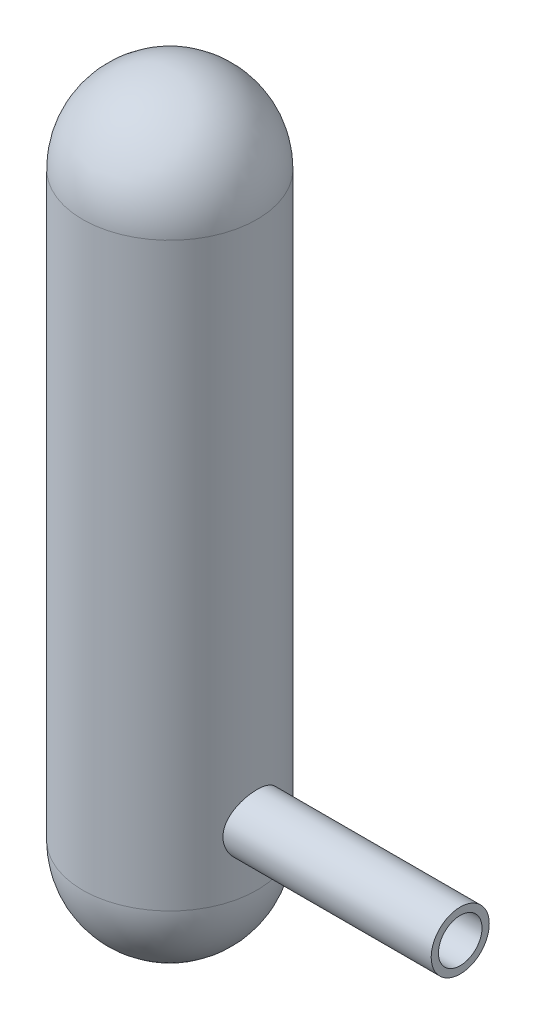
ISO-10303-21;
HEADER;
FILE_DESCRIPTION(('STEP AP214'),'2;1');
FILE_NAME('part.step','',(''),(''),'','','');
FILE_SCHEMA(('AUTOMOTIVE_DESIGN { 1 0 10303 214 1 1 1 1 }'));
ENDSEC;
DATA;
#1=APPLICATION_CONTEXT('core data for automotive mechanical design processes');
#2=APPLICATION_PROTOCOL_DEFINITION('international standard','automotive_design',2000,#1);
#3=PRODUCT_CONTEXT('',#1,'mechanical');
#4=PRODUCT('Part','Part','',(#3));
#5=PRODUCT_RELATED_PRODUCT_CATEGORY('part','',(#4));
#6=PRODUCT_DEFINITION_FORMATION('','',#4);
#7=PRODUCT_DEFINITION_CONTEXT('part definition',#1,'design');
#8=PRODUCT_DEFINITION('design','',#6,#7);
#9=PRODUCT_DEFINITION_SHAPE('','',#8);
#10=(LENGTH_UNIT() NAMED_UNIT(*) SI_UNIT(.MILLI.,.METRE.));
#11=(NAMED_UNIT(*) PLANE_ANGLE_UNIT() SI_UNIT($,.RADIAN.));
#12=(NAMED_UNIT(*) SI_UNIT($,.STERADIAN.) SOLID_ANGLE_UNIT());
#13=UNCERTAINTY_MEASURE_WITH_UNIT(LENGTH_MEASURE(1.E-05),#10,'distance_accuracy_value','');
#14=(GEOMETRIC_REPRESENTATION_CONTEXT(3) GLOBAL_UNCERTAINTY_ASSIGNED_CONTEXT((#13)) GLOBAL_UNIT_ASSIGNED_CONTEXT((#10,
#11,#12)) REPRESENTATION_CONTEXT('',''));
#15=CARTESIAN_POINT('',(0.,0.,0.));
#16=DIRECTION('',(0.,0.,1.));
#17=DIRECTION('',(1.,0.,0.));
#18=AXIS2_PLACEMENT_3D('',#15,#16,#17);
#19=CARTESIAN_POINT('',(1000.,200.,0.));
#20=DIRECTION('',(-1.,0.,0.));
#21=DIRECTION('',(0.,0.,1.));
#22=AXIS2_PLACEMENT_3D('',#19,#20,#21);
#23=CYLINDRICAL_SURFACE('',#22,75.);
#24=CARTESIAN_POINT('',(1000.,200.,0.));
#25=DIRECTION('',(1.,0.,0.));
#26=DIRECTION('',(0.,0.,-1.));
#27=AXIS2_PLACEMENT_3D('',#24,#25,#26);
#28=CIRCLE('',#27,75.);
#29=CARTESIAN_POINT('',(1000.,200.,-75.));
#30=VERTEX_POINT('',#29);
#31=EDGE_CURVE('E127',#30,#30,#28,.T.);
#32=ORIENTED_EDGE('',*,*,#31,.T.);
#33=EDGE_LOOP('',(#32));
#34=FACE_BOUND('',#33,.T.);
#35=CARTESIAN_POINT('',(238.484800354236,200.,75.));
#36=CARTESIAN_POINT('',(238.484803362046,202.054944345938,74.9999959454744));
#37=CARTESIAN_POINT('',(238.511432766793,204.109959481146,74.915472874642));
#38=CARTESIAN_POINT('',(238.617117663262,208.204813565608,74.5781603170427));
#39=CARTESIAN_POINT('',(238.696175589537,210.244651805664,74.3253630163425));
#40=CARTESIAN_POINT('',(238.904269147766,214.294802421525,73.6537408685828));
#41=CARTESIAN_POINT('',(239.033319183433,216.305106114426,73.2348681711068));
#42=CARTESIAN_POINT('',(239.337421960664,220.281311892774,72.2348332013811));
#43=CARTESIAN_POINT('',(239.512474419089,222.247214251426,71.6536719279966));
#44=CARTESIAN_POINT('',(239.902991472848,226.117948260138,70.335098989744));
#45=CARTESIAN_POINT('',(240.118386936757,228.022877949325,69.5979543402923));
#46=CARTESIAN_POINT('',(240.583522096695,231.762783779222,67.9726626230715));
#47=CARTESIAN_POINT('',(240.83326181346,233.597759877696,67.0845154641338));
#48=CARTESIAN_POINT('',(241.3600763598,237.186527777388,65.1636777984914));
#49=CARTESIAN_POINT('',(241.63715403406,238.940311102035,64.1309722448923));
#50=CARTESIAN_POINT('',(242.211050436437,242.355967837015,61.9282004902777));
#51=CARTESIAN_POINT('',(242.507869598328,244.017839226321,60.7581312705743));
#52=CARTESIAN_POINT('',(243.122038493762,247.286102180649,58.2527659888747));
#53=CARTESIAN_POINT('',(243.439732910964,248.889535056023,56.9136932826894));
#54=CARTESIAN_POINT('',(244.078901357624,251.978788807856,54.1069410196682));
#55=CARTESIAN_POINT('',(244.400375452327,253.464607650596,52.6392592399157));
#56=CARTESIAN_POINT('',(245.038417159071,256.309395246322,49.5843597922395));
#57=CARTESIAN_POINT('',(245.354984159748,257.668348297678,47.9971273718579));
#58=CARTESIAN_POINT('',(245.974641414631,260.250271805585,44.7131688898997));
#59=CARTESIAN_POINT('',(246.277731572937,261.473241294581,43.0164420493805));
#60=CARTESIAN_POINT('',(246.868330344282,263.798618824442,39.4878786266799));
#61=CARTESIAN_POINT('',(247.15538557608,264.898001297484,37.6539700644528));
#62=CARTESIAN_POINT('',(247.698826567943,266.937848442572,33.8953746098052));
#63=CARTESIAN_POINT('',(247.955211778011,267.878310264864,31.9706860903167));
#64=CARTESIAN_POINT('',(248.429931198131,269.592450871222,28.0442273300095));
#65=CARTESIAN_POINT('',(248.648271749221,270.366157454074,26.0424700025585));
#66=CARTESIAN_POINT('',(249.04060479395,271.740203539219,21.9760906305317));
#67=CARTESIAN_POINT('',(249.214598801727,272.340548960728,19.9114707349867));
#68=CARTESIAN_POINT('',(249.508845939964,273.347729675793,15.7946805595964));
#69=CARTESIAN_POINT('',(249.630493892201,273.759608855983,13.7438433659757));
#70=CARTESIAN_POINT('',(249.823684177877,274.410820014438,9.61261202362182));
#71=CARTESIAN_POINT('',(249.895227378883,274.650154980324,7.53221838729754));
#72=CARTESIAN_POINT('',(249.98616289974,274.954003873961,3.35794477255079));
#73=CARTESIAN_POINT('',(250.005564687308,275.018549539566,1.26406731171352));
#74=CARTESIAN_POINT('',(249.991688040944,274.972292633537,-2.9215546301748));
#75=CARTESIAN_POINT('',(249.958410574077,274.861493280816,-5.01329914967619));
#76=CARTESIAN_POINT('',(249.842023326546,274.471938321394,-9.11223211400847));
#77=CARTESIAN_POINT('',(249.760536907684,274.198652756018,-11.1199894609785));
#78=CARTESIAN_POINT('',(249.551269163787,273.491156243642,-15.1044326994678));
#79=CARTESIAN_POINT('',(249.423488995923,273.056949319073,-17.0811193663501));
#80=CARTESIAN_POINT('',(249.124995582514,272.031270305156,-20.9899789419987));
#81=CARTESIAN_POINT('',(248.95428075981,271.439792438579,-22.9221502126922));
#82=CARTESIAN_POINT('',(248.574359750839,270.104363669525,-26.7291526066006));
#83=CARTESIAN_POINT('',(248.365152833448,269.360409870865,-28.6039826398787));
#84=CARTESIAN_POINT('',(247.910985846433,267.716232561992,-32.3057427586249));
#85=CARTESIAN_POINT('',(247.665638567891,266.814293625678,-34.1318630831252));
#86=CARTESIAN_POINT('',(247.147388612929,264.866881444385,-37.701751138697));
#87=CARTESIAN_POINT('',(246.874485834351,263.821407667262,-39.4455185644204));
#88=CARTESIAN_POINT('',(246.308048197443,261.593949735283,-42.8404956047092));
#89=CARTESIAN_POINT('',(246.014509298429,260.411938816278,-44.4916869778811));
#90=CARTESIAN_POINT('',(245.414302748772,257.919279846012,-47.6914063197072));
#91=CARTESIAN_POINT('',(245.107634754962,256.60862843121,-49.2399316021945));
#92=CARTESIAN_POINT('',(244.477016870661,253.813895206442,-52.2828361401766));
#93=CARTESIAN_POINT('',(244.152856690515,252.325073289401,-53.7728216936136));
#94=CARTESIAN_POINT('',(243.507712124196,249.227033417636,-56.6226928138748));
#95=CARTESIAN_POINT('',(243.186727821491,247.617812308021,-57.9825749693953));
#96=CARTESIAN_POINT('',(242.556888866537,244.288994577424,-60.563360634236));
#97=CARTESIAN_POINT('',(242.248035507129,242.569386243212,-61.7842493566623));
#98=CARTESIAN_POINT('',(241.651335128698,239.030864379727,-64.0783705837883));
#99=CARTESIAN_POINT('',(241.363488027103,237.21195124085,-65.1516036689044));
#100=CARTESIAN_POINT('',(240.814632138039,233.468596748267,-67.152064253776));
#101=CARTESIAN_POINT('',(240.55390891473,231.543306930496,-68.0777840443845));
#102=CARTESIAN_POINT('',(240.070578862231,227.616630956083,-69.7630725593564));
#103=CARTESIAN_POINT('',(239.847972446889,225.615243973514,-70.5226394797608));
#104=CARTESIAN_POINT('',(239.448052100327,221.551260533948,-71.8687958418809));
#105=CARTESIAN_POINT('',(239.270726054931,219.488680613503,-72.4554315555978));
#106=CARTESIAN_POINT('',(238.967139763804,215.317300231942,-73.4505097128343));
#107=CARTESIAN_POINT('',(238.840877468003,213.208501629962,-73.8589593100844));
#108=CARTESIAN_POINT('',(238.647347676171,209.040349402686,-74.4818476703334));
#109=CARTESIAN_POINT('',(238.578056005707,206.982083985516,-74.7029525747702));
#110=CARTESIAN_POINT('',(238.492938125984,202.853232054208,-74.9742553040991));
#111=CARTESIAN_POINT('',(238.477110591955,200.782645846636,-75.0244573637293));
#112=CARTESIAN_POINT('',(238.499426675574,196.644980981873,-74.9534840019989));
#113=CARTESIAN_POINT('',(238.537563451479,194.577901913301,-74.8323303055881));
#114=CARTESIAN_POINT('',(238.666575418194,190.462480645233,-74.4198383419947));
#115=CARTESIAN_POINT('',(238.757450169826,188.41413828985,-74.1285014920175));
#116=CARTESIAN_POINT('',(238.986037218014,184.404204744581,-73.3881429841918));
#117=CARTESIAN_POINT('',(239.122468381414,182.441743444679,-72.9434245296467));
#118=CARTESIAN_POINT('',(239.438598094207,178.562175391249,-71.898923055049));
#119=CARTESIAN_POINT('',(239.618295705299,176.645067655149,-71.2991433977156));
#120=CARTESIAN_POINT('',(240.015824464503,172.868407100433,-69.9492575448616));
#121=CARTESIAN_POINT('',(240.233659966782,171.00886088212,-69.1991341833215));
#122=CARTESIAN_POINT('',(240.701379460545,167.359068335274,-67.5542491425179));
#123=CARTESIAN_POINT('',(240.951264342151,165.568823933288,-66.659483445862));
#124=CARTESIAN_POINT('',(241.483372838697,162.02136093955,-64.7057385285045));
#125=CARTESIAN_POINT('',(241.766284214673,160.266317082404,-63.6429976030729));
#126=CARTESIAN_POINT('',(242.350944751397,156.851288033229,-61.3790349281544));
#127=CARTESIAN_POINT('',(242.652694174164,155.191304164012,-60.1778112523035));
#128=CARTESIAN_POINT('',(243.266960580257,151.97599214024,-57.6444664574116));
#129=CARTESIAN_POINT('',(243.579479778818,150.420685713421,-56.3123183028917));
#130=CARTESIAN_POINT('',(244.206976216186,147.424399318268,-53.5256229916625));
#131=CARTESIAN_POINT('',(244.521953507536,145.983421801172,-52.0710732120106));
#132=CARTESIAN_POINT('',(245.157962686465,143.17244017251,-48.9911997782523));
#133=CARTESIAN_POINT('',(245.478773559719,141.807176018038,-47.3614997869999));
#134=CARTESIAN_POINT('',(246.105264147131,139.2185993441,-43.9902044763878));
#135=CARTESIAN_POINT('',(246.410943447107,137.995290709021,-42.2486060971319));
#136=CARTESIAN_POINT('',(246.998627615098,135.699504268496,-38.6648982407684));
#137=CARTESIAN_POINT('',(247.280633009248,134.627023110671,-36.8227909988924));
#138=CARTESIAN_POINT('',(247.813038137747,132.641129882753,-33.050356849425));
#139=CARTESIAN_POINT('',(248.063438478752,131.727714759274,-31.1200316361383));
#140=CARTESIAN_POINT('',(248.52374828867,130.073753796474,-27.1994862989342));
#141=CARTESIAN_POINT('',(248.733951198377,129.331946158433,-25.2098332935094));
#142=CARTESIAN_POINT('',(249.110224940259,128.018750600551,-21.1709416553198));
#143=CARTESIAN_POINT('',(249.276295806939,127.447362547464,-19.1217030691444));
#144=CARTESIAN_POINT('',(249.559468112757,126.480328765218,-14.9793326195232));
#145=CARTESIAN_POINT('',(249.676581179523,126.084641305238,-12.8862113025213));
#146=CARTESIAN_POINT('',(249.858459889044,125.472584349398,-8.6716815601499));
#147=CARTESIAN_POINT('',(249.923227282682,125.256208855819,-6.55027408332242));
#148=CARTESIAN_POINT('',(249.997061589514,125.009709257433,-2.37785209283133));
#149=CARTESIAN_POINT('',(250.008179171167,124.972727834933,-0.327275945667309));
#150=CARTESIAN_POINT('',(249.979970856254,125.066776807664,3.76963446498688));
#151=CARTESIAN_POINT('',(249.940646341217,125.197802601439,5.815968843115));
#152=CARTESIAN_POINT('',(249.812635017411,125.626655743037,9.88937329942695));
#153=CARTESIAN_POINT('',(249.723951161468,125.924473112888,11.916444522614));
#154=CARTESIAN_POINT('',(249.499635556526,126.684246495182,15.9369298587504));
#155=CARTESIAN_POINT('',(249.364003622926,127.146203153028,17.9303438393257));
#156=CARTESIAN_POINT('',(249.051141898477,128.224417659987,21.8483333163827));
#157=CARTESIAN_POINT('',(248.874376471509,128.838957804475,23.7734193432882));
#158=CARTESIAN_POINT('',(248.483074590039,130.219798670297,27.5643433033345));
#159=CARTESIAN_POINT('',(248.268538574326,130.986097628625,29.430181924469));
#160=CARTESIAN_POINT('',(247.807156903572,132.664734263121,33.0910493196195));
#161=CARTESIAN_POINT('',(247.560307283934,133.577089862227,34.88606936959));
#162=CARTESIAN_POINT('',(247.040549331605,135.541256095654,38.3941642218435));
#163=CARTESIAN_POINT('',(246.767640294738,136.593070498715,40.1072368078717));
#164=CARTESIAN_POINT('',(246.193534346893,138.864884853834,43.4946963865407));
#165=CARTESIAN_POINT('',(245.891711678493,140.089189725617,45.1660911948919));
#166=CARTESIAN_POINT('',(245.275552821997,142.67053683193,48.4005603597586));
#167=CARTESIAN_POINT('',(244.961216383135,144.027581727255,49.9636325438567));
#168=CARTESIAN_POINT('',(244.328263573903,146.866070168884,52.9722931758266));
#169=CARTESIAN_POINT('',(244.009646081036,148.347546897942,54.4178500818709));
#170=CARTESIAN_POINT('',(243.376713905676,151.425391381795,57.1820428344099));
#171=CARTESIAN_POINT('',(243.062399269558,153.021760373733,58.5006773138658));
#172=CARTESIAN_POINT('',(242.43739151847,156.36891810003,61.0399210348816));
#173=CARTESIAN_POINT('',(242.127086587322,158.122893915833,62.2564291321634));
#174=CARTESIAN_POINT('',(241.529188951777,161.731034014086,64.537131949372));
#175=CARTESIAN_POINT('',(241.24159717435,163.585202380403,65.6013204542648));
#176=CARTESIAN_POINT('',(240.69795326227,167.38052876612,67.568757733961));
#177=CARTESIAN_POINT('',(240.44188817339,169.321650606412,68.4720726798437));
#178=CARTESIAN_POINT('',(239.969177301982,173.278072117955,70.1107840120055));
#179=CARTESIAN_POINT('',(239.752527630248,175.29336444702,70.8461969673759));
#180=CARTESIAN_POINT('',(239.386497624678,179.162662046685,72.0726608567341));
#181=CARTESIAN_POINT('',(239.232380402562,181.010595973306,72.5815200271809));
#182=CARTESIAN_POINT('',(238.965103896507,184.742740100251,73.4567147266646));
#183=CARTESIAN_POINT('',(238.851941109274,186.626947183193,73.8230624465109));
#184=CARTESIAN_POINT('',(238.66963641276,190.419687065345,74.4103447220252));
#185=CARTESIAN_POINT('',(238.600487082471,192.328215708371,74.6313037915502));
#186=CARTESIAN_POINT('',(238.508066226095,196.157808431491,74.9261378819663));
#187=CARTESIAN_POINT('',(238.484797542295,198.078873280801,75.0000037904956));
#188=CARTESIAN_POINT('',(238.484800354236,200.,75.));
#189=B_SPLINE_CURVE_WITH_KNOTS('',3,(#35,#36,#37,#38,#39,#40,#41,#42,#43,#44,#45,#46,#47,#48,
#49,#50,#51,#52,#53,#54,#55,#56,#57,#58,#59,#60,#61,#62,#63,#64,#65,#66,#67,#68,#69,#70,#71,#72,
#73,#74,#75,#76,#77,#78,#79,#80,#81,#82,#83,#84,#85,#86,#87,#88,#89,#90,#91,#92,#93,#94,#95,#96,
#97,#98,#99,#100,#101,#102,#103,#104,#105,#106,#107,#108,#109,#110,#111,#112,#113,#114,#115,
#116,#117,#118,#119,#120,#121,#122,#123,#124,#125,#126,#127,#128,#129,#130,#131,#132,#133,#134,
#135,#136,#137,#138,#139,#140,#141,#142,#143,#144,#145,#146,#147,#148,#149,#150,#151,#152,#153,
#154,#155,#156,#157,#158,#159,#160,#161,#162,#163,#164,#165,#166,#167,#168,#169,#170,#171,#172,
#173,#174,#175,#176,#177,#178,#179,#180,#181,#182,#183,#184,#185,#186,#187,#188),.UNSPECIFIED.,
.T.,.F.,(4,2,2,2,2,2,2,2,2,2,2,2,2,2,2,2,2,2,2,2,2,2,2,2,2,2,2,2,2,2,2,2,2,2,2,2,2,2,2,2,2,2,2,
2,2,2,2,2,2,2,2,2,2,2,2,2,2,2,2,2,2,2,2,2,2,2,2,2,2,2,2,2,2,2,2,2,4),(0.,6.1630543790611,
12.3263949638987,18.4915126511172,24.6565923936698,30.8112027926145,36.9658169074556,
43.1210721250666,49.2764626351746,55.6084129529262,61.9404727355334,68.2733151736875,
74.6062026686047,81.0703997171654,87.5347126689305,93.9979471580909,100.460960941502,
106.73910997405,113.017150297181,119.294050591185,125.570835657684,131.647409703223,
137.723831867466,143.800477275275,149.877238115691,156.024611964987,162.172008605723,
168.320612316758,174.469376837102,180.855357077313,187.241504711709,193.628331106368,
200.015132394475,206.463520844248,212.911979302151,219.358710746811,225.805183347371,
232.011288875994,238.217240624709,244.422405636469,250.627518975267,256.671067648642,
262.714485270193,268.758593313637,274.802869259003,281.009310630304,287.215838346713,
293.423650394527,299.631595503343,306.074140066313,312.516860877713,318.959438466845,
325.401892372505,331.795353194759,338.18880901816,344.580745512233,350.972468196894,
357.117832082756,363.263027660308,369.407855653109,375.552707807919,381.631293971108,
387.709809522583,393.789071554967,399.868497907083,406.142468319648,412.416564520724,
418.692339205876,424.968181477721,431.431363249243,437.894808660185,444.35558933265,
450.815732159313,456.578557488256,462.3408897413,468.102250163254,473.863967488053),.UNSPECIFIED.);
#190=CARTESIAN_POINT('',(238.484800354236,200.,75.));
#191=VERTEX_POINT('',#190);
#192=EDGE_CURVE('E53',#191,#191,#189,.T.);
#193=ORIENTED_EDGE('',*,*,#192,.T.);
#194=EDGE_LOOP('',(#193));
#195=FACE_BOUND('',#194,.T.);
#196=ADVANCED_FACE('F49',(#34,#195),#23,.F.);
#197=CARTESIAN_POINT('',(0.,2000.,0.));
#198=DIRECTION('',(0.,-1.,0.));
#199=DIRECTION('',(0.,0.,-1.));
#200=AXIS2_PLACEMENT_3D('',#197,#198,#199);
#201=CYLINDRICAL_SURFACE('',#200,300.);
#202=CARTESIAN_POINT('',(0.,2000.,0.));
#203=DIRECTION('',(0.,1.,0.));
#204=DIRECTION('',(0.,0.,1.));
#205=AXIS2_PLACEMENT_3D('',#202,#203,#204);
#206=CIRCLE('',#205,300.);
#207=CARTESIAN_POINT('',(0.,2000.,300.));
#208=VERTEX_POINT('',#207);
#209=EDGE_CURVE('E63',#208,#208,#206,.T.);
#210=ORIENTED_EDGE('',*,*,#209,.F.);
#211=EDGE_LOOP('',(#210));
#212=FACE_BOUND('',#211,.T.);
#213=CARTESIAN_POINT('',(0.,0.,0.));
#214=DIRECTION('',(0.,1.,0.));
#215=DIRECTION('',(0.,0.,1.));
#216=AXIS2_PLACEMENT_3D('',#213,#214,#215);
#217=CIRCLE('',#216,300.);
#218=CARTESIAN_POINT('',(0.,0.,300.));
#219=VERTEX_POINT('',#218);
#220=EDGE_CURVE('E68',#219,#219,#217,.T.);
#221=ORIENTED_EDGE('',*,*,#220,.T.);
#222=EDGE_LOOP('',(#221));
#223=FACE_BOUND('',#222,.T.);
#224=CARTESIAN_POINT('',(282.842712474619,200.,100.));
#225=CARTESIAN_POINT('',(282.842711586747,197.276581204264,100.000001139758));
#226=CARTESIAN_POINT('',(282.882153634822,194.55317898195,99.8886524868746));
#227=CARTESIAN_POINT('',(283.038638647704,189.126798434441,99.4443775479658));
#228=CARTESIAN_POINT('',(283.15568105255,186.423819962011,99.1114528608176));
#229=CARTESIAN_POINT('',(283.463631820998,181.057789523236,98.2272262635226));
#230=CARTESIAN_POINT('',(283.654549883575,178.394742847157,97.67589567911));
#231=CARTESIAN_POINT('',(284.104260073533,173.127774920642,96.360012637971));
#232=CARTESIAN_POINT('',(284.363052784515,170.523854178793,95.5954583478959));
#233=CARTESIAN_POINT('',(284.940052239268,165.397870169635,93.8615938236245));
#234=CARTESIAN_POINT('',(285.258138602869,162.875652992335,92.8926979366559));
#235=CARTESIAN_POINT('',(285.944761935768,157.92362994265,90.7570949202558));
#236=CARTESIAN_POINT('',(286.313298753795,155.493823793205,89.5903883839416));
#237=CARTESIAN_POINT('',(287.090520390752,150.740831808775,87.0676433898226));
#238=CARTESIAN_POINT('',(287.499211887065,148.417663801366,85.7115734266417));
#239=CARTESIAN_POINT('',(288.345616618095,143.891730683651,82.819531962996));
#240=CARTESIAN_POINT('',(288.783330646084,141.688968867408,81.283555544274));
#241=CARTESIAN_POINT('',(289.692181898426,137.340273668077,77.9837821988007));
#242=CARTESIAN_POINT('',(290.163954091276,135.199140506577,76.2138295837156));
#243=CARTESIAN_POINT('',(291.113394746462,131.072192888774,72.5028262696415));
#244=CARTESIAN_POINT('',(291.591063331664,129.086381675356,70.5617720001091));
#245=CARTESIAN_POINT('',(292.539617105058,125.281713071851,66.5197664060021));
#246=CARTESIAN_POINT('',(293.010501238604,123.4628814077,64.418790533781));
#247=CARTESIAN_POINT('',(293.702153431878,120.869417129622,61.1578442730483));
#248=CARTESIAN_POINT('',(293.930288178728,120.027288755596,60.0524591389559));
#249=CARTESIAN_POINT('',(294.380183046899,118.389263596681,57.8067341656081));
#250=CARTESIAN_POINT('',(294.60194374097,117.593362651351,56.6663974861274));
#251=CARTESIAN_POINT('',(295.04333607069,116.028885272484,54.3220927261915));
#252=CARTESIAN_POINT('',(295.262758723041,115.261575980696,53.1172400063744));
#253=CARTESIAN_POINT('',(295.69177000845,113.778618719166,50.6745947966205));
#254=CARTESIAN_POINT('',(295.901359575554,113.062965839085,49.4368054529133));
#255=CARTESIAN_POINT('',(296.30926519031,111.684576016772,46.9300763814229));
#256=CARTESIAN_POINT('',(296.507579791218,111.021845860907,45.6611326858572));
#257=CARTESIAN_POINT('',(296.891469089852,109.750836988619,43.0945363560096));
#258=CARTESIAN_POINT('',(297.077045107504,109.142552628724,41.7968867146168));
#259=CARTESIAN_POINT('',(297.434123923065,107.981724263772,39.1751448637654));
#260=CARTESIAN_POINT('',(297.605628143569,107.42917462288,37.8510553441322));
#261=CARTESIAN_POINT('',(297.933320678896,106.381030907702,35.1788045452259));
#262=CARTESIAN_POINT('',(298.089510496399,105.885431244545,33.8306456430658));
#263=CARTESIAN_POINT('',(298.385449341867,104.952263541044,31.1125779139266));
#264=CARTESIAN_POINT('',(298.525198038379,104.514696670621,29.742668649091));
#265=CARTESIAN_POINT('',(298.787213133015,103.698660052577,26.9837225689162));
#266=CARTESIAN_POINT('',(298.909479793087,103.320189419466,25.594686040517));
#267=CARTESIAN_POINT('',(299.131684143469,102.635398406685,22.8487718406241));
#268=CARTESIAN_POINT('',(299.23225064547,102.327026093658,21.4924564419925));
#269=CARTESIAN_POINT('',(299.41553960818,101.766933224648,18.7669924417629));
#270=CARTESIAN_POINT('',(299.498262279084,101.515212001334,17.3978439915319));
#271=CARTESIAN_POINT('',(299.645281671929,101.069017964521,14.6492111279181));
#272=CARTESIAN_POINT('',(299.709577682507,100.87454736118,13.2697263176079));
#273=CARTESIAN_POINT('',(299.819276061089,100.543362632928,10.5032316160041));
#274=CARTESIAN_POINT('',(299.864680326107,100.406642708962,9.11622249444008));
#275=CARTESIAN_POINT('',(299.936275251859,100.191285307427,6.33737542810366));
#276=CARTESIAN_POINT('',(299.962468234502,100.11264081075,4.94553808731521));
#277=CARTESIAN_POINT('',(299.995459972136,100.01360999241,2.15969815211106));
#278=CARTESIAN_POINT('',(300.002260624141,99.9932179723203,0.76569578283387));
#279=CARTESIAN_POINT('',(299.99642424576,100.01072745257,-2.02194193388745));
#280=CARTESIAN_POINT('',(299.983786643131,100.048630669066,-3.41557726931842));
#281=CARTESIAN_POINT('',(299.93916331819,100.182638318562,-6.19972874282647));
#282=CARTESIAN_POINT('',(299.907177744411,100.278742304757,-7.59024490476709));
#283=CARTESIAN_POINT('',(299.825723475953,100.523986549312,-10.3108770679396));
#284=CARTESIAN_POINT('',(299.776992034496,100.670891732112,-11.6412172843623));
#285=CARTESIAN_POINT('',(299.662202814341,101.017867232433,-14.2943119947485));
#286=CARTESIAN_POINT('',(299.596143555703,101.217942091102,-15.6170658309069));
#287=CARTESIAN_POINT('',(299.447143390483,101.670770471344,-18.2523948192768));
#288=CARTESIAN_POINT('',(299.364204572401,101.923517475911,-19.5649712099013));
#289=CARTESIAN_POINT('',(299.181972664174,102.481169992026,-22.1779768831676));
#290=CARTESIAN_POINT('',(299.082678047631,102.786080371801,-23.478405020098));
#291=CARTESIAN_POINT('',(298.868389495874,103.447361170815,-26.0647158301923));
#292=CARTESIAN_POINT('',(298.753396499549,103.803728512584,-27.3505993682644));
#293=CARTESIAN_POINT('',(298.508434210358,104.567217262988,-29.9058900199961));
#294=CARTESIAN_POINT('',(298.37846354652,104.974343318067,-31.1752956135064));
#295=CARTESIAN_POINT('',(298.104392594921,105.838453968219,-33.6953628490884));
#296=CARTESIAN_POINT('',(297.960293367158,106.295434823217,-34.946025889219));
#297=CARTESIAN_POINT('',(297.658853214359,107.258412697059,-37.4268435131093));
#298=CARTESIAN_POINT('',(297.501511065235,107.764414247709,-38.6569961884064));
#299=CARTESIAN_POINT('',(297.172452256217,108.831325454668,-41.1106514101889));
#300=CARTESIAN_POINT('',(297.000575140818,109.392864123555,-42.3338589411013));
#301=CARTESIAN_POINT('',(296.64533330319,110.564183744707,-44.7553791295131));
#302=CARTESIAN_POINT('',(296.461967530198,111.173969111002,-45.9536894965101));
#303=CARTESIAN_POINT('',(296.084932421277,112.440576153952,-48.3234093025386));
#304=CARTESIAN_POINT('',(295.891264028237,113.097393528163,-49.4948211893028));
#305=CARTESIAN_POINT('',(295.49482473181,114.456945526457,-51.8091472484455));
#306=CARTESIAN_POINT('',(295.292053024058,115.159684210638,-52.9520588886195));
#307=CARTESIAN_POINT('',(294.671900817728,117.335237945846,-56.3358351100428));
#308=CARTESIAN_POINT('',(294.242675515183,118.875416373427,-58.5317890267191));
#309=CARTESIAN_POINT('',(293.363489224682,122.124568405537,-62.7900769330577));
#310=CARTESIAN_POINT('',(292.913527585274,123.83354731503,-64.8524067198832));
#311=CARTESIAN_POINT('',(291.98239786465,127.494834472648,-68.9263863140992));
#312=CARTESIAN_POINT('',(291.500758340608,129.454813649869,-70.9310700337785));
#313=CARTESIAN_POINT('',(290.780292510917,132.515465350866,-73.8092227374023));
#314=CARTESIAN_POINT('',(290.540434478931,133.555957707698,-74.7472561542025));
#315=CARTESIAN_POINT('',(290.063009221665,135.675701945544,-76.5790177148909));
#316=CARTESIAN_POINT('',(289.82544178484,136.754950202952,-77.472749982354));
#317=CARTESIAN_POINT('',(289.35419371695,138.950841645239,-79.214677146307));
#318=CARTESIAN_POINT('',(289.120514091671,140.06749428832,-80.0628603817986));
#319=CARTESIAN_POINT('',(288.658773031024,142.336142553495,-81.7119688469851));
#320=CARTESIAN_POINT('',(288.430711074981,143.488134877738,-82.512898466056));
#321=CARTESIAN_POINT('',(287.981800336553,145.825898027383,-84.0662619601302));
#322=CARTESIAN_POINT('',(287.760952250392,147.011672092572,-84.818691161046));
#323=CARTESIAN_POINT('',(287.328125769633,149.41493529166,-86.2735422748399));
#324=CARTESIAN_POINT('',(287.116146534315,150.632421401593,-86.9759689321399));
#325=CARTESIAN_POINT('',(286.699626361439,153.115090164408,-88.3393438092824));
#326=CARTESIAN_POINT('',(286.495236979966,154.38070764349,-88.999546858607));
#327=CARTESIAN_POINT('',(286.098800304611,156.940481280398,-90.2658108270008));
#328=CARTESIAN_POINT('',(285.906751785596,158.234634588156,-90.8718771228079));
#329=CARTESIAN_POINT('',(285.536480224059,160.849560963755,-92.0287313795914));
#330=CARTESIAN_POINT('',(285.358258911368,162.170337336279,-92.5795124267146));
#331=CARTESIAN_POINT('',(285.017134950317,164.835896334691,-93.6244351069747));
#332=CARTESIAN_POINT('',(284.854230683506,166.180676406361,-94.1185827253986));
#333=CARTESIAN_POINT('',(284.545106016417,168.891635860013,-95.0490555367597));
#334=CARTESIAN_POINT('',(284.398881741979,170.2578101887,-95.4853941604563));
#335=CARTESIAN_POINT('',(284.124322654763,173.009184095366,-96.299292565209));
#336=CARTESIAN_POINT('',(283.99598600441,174.394381703023,-96.6768583843908));
#337=CARTESIAN_POINT('',(283.75828652433,177.181306490839,-97.3723261696948));
#338=CARTESIAN_POINT('',(283.648923912999,178.583033861063,-97.6902274490642));
#339=CARTESIAN_POINT('',(283.4501309385,181.400244465839,-98.2655379331742));
#340=CARTESIAN_POINT('',(283.360700371799,182.815727559774,-98.5229477556151));
#341=CARTESIAN_POINT('',(283.206135518782,185.593393512975,-98.9663445900275));
#342=CARTESIAN_POINT('',(283.140086010416,186.955094849317,-99.1550332434004));
#343=CARTESIAN_POINT('',(283.027412673541,189.686040322855,-99.4761914770955));
#344=CARTESIAN_POINT('',(282.980790557235,191.055285114112,-99.6086561022174));
#345=CARTESIAN_POINT('',(282.907367798799,193.798501923032,-99.8169998021659));
#346=CARTESIAN_POINT('',(282.880565697674,195.172473585259,-99.8928830420753));
#347=CARTESIAN_POINT('',(282.846999140749,197.922628298471,-99.9878873737001));
#348=CARTESIAN_POINT('',(282.840234752651,199.298811356912,-100.007008273632));
#349=CARTESIAN_POINT('',(282.846799462838,202.050514240597,-99.9884399757831));
#350=CARTESIAN_POINT('',(282.860125180277,203.426034138477,-99.9507603366327));
#351=CARTESIAN_POINT('',(282.906753527644,206.174020179137,-99.8187041896032));
#352=CARTESIAN_POINT('',(282.940056314578,207.546486297833,-99.7243272361271));
#353=CARTESIAN_POINT('',(283.02636076179,210.285654836889,-99.4791233930167));
#354=CARTESIAN_POINT('',(283.079361189789,211.652357612394,-99.3283000346528));
#355=CARTESIAN_POINT('',(283.204631689873,214.377636466341,-98.9705638256163));
#356=CARTESIAN_POINT('',(283.27690344849,215.736211822867,-98.7636460658116));
#357=CARTESIAN_POINT('',(283.437306586648,218.395855551783,-98.3023434463297));
#358=CARTESIAN_POINT('',(283.52480417323,219.697289801494,-98.0498443057531));
#359=CARTESIAN_POINT('',(283.716561796744,222.288032246709,-97.4935849689767));
#360=CARTESIAN_POINT('',(283.820823333532,223.577339346272,-97.1898201859615));
#361=CARTESIAN_POINT('',(284.045317359909,226.141407076671,-96.5317487064975));
#362=CARTESIAN_POINT('',(284.165547866123,227.416169492667,-96.1774482862638));
#363=CARTESIAN_POINT('',(284.421124878798,229.949363915093,-95.4189910774688));
#364=CARTESIAN_POINT('',(284.556472767102,231.20779441691,-95.0148297308911));
#365=CARTESIAN_POINT('',(284.841310185511,233.706265934862,-94.157485285466));
#366=CARTESIAN_POINT('',(284.990800199299,234.946306320349,-93.7043005098674));
#367=CARTESIAN_POINT('',(285.302877051418,237.406152602429,-92.7497734275371));
#368=CARTESIAN_POINT('',(285.465465040902,238.625956709109,-92.2484268872187));
#369=CARTESIAN_POINT('',(285.802596006461,241.043344610459,-91.1985747979668));
#370=CARTESIAN_POINT('',(285.977138235878,242.240929786988,-90.6500721938382));
#371=CARTESIAN_POINT('',(286.33699965096,244.612236104051,-89.5068804192323));
#372=CARTESIAN_POINT('',(286.52231982434,245.785955044084,-88.9121870140437));
#373=CARTESIAN_POINT('',(287.104633661066,249.342167233325,-87.0212968300719));
#374=CARTESIAN_POINT('',(287.517248724175,251.683452324223,-85.6513298726324));
#375=CARTESIAN_POINT('',(288.371738962718,256.243032558302,-82.7288170004495));
#376=CARTESIAN_POINT('',(288.813614600485,258.461325757129,-81.1762682005167));
#377=CARTESIAN_POINT('',(289.71502790508,262.763218780979,-77.8979591312651));
#378=CARTESIAN_POINT('',(290.174570015988,264.84678435644,-76.1721551005482));
#379=CARTESIAN_POINT('',(291.099260565793,268.866588644532,-72.5582516117769));
#380=CARTESIAN_POINT('',(291.564409157521,270.802823330363,-70.6701477207958));
#381=CARTESIAN_POINT('',(292.510812732768,274.606503596201,-66.6475287431781));
#382=CARTESIAN_POINT('',(292.991764224439,276.466142600633,-64.5055250222511));
#383=CARTESIAN_POINT('',(293.697961605594,279.11521393227,-61.1783883646033));
#384=CARTESIAN_POINT('',(293.930856973125,279.97496093182,-60.0501391724582));
#385=CARTESIAN_POINT('',(294.389993283672,281.646271729264,-57.7572339129003));
#386=CARTESIAN_POINT('',(294.616234878781,282.457840256805,-56.5925814363655));
#387=CARTESIAN_POINT('',(295.060513699833,284.031402075396,-54.2285906741306));
#388=CARTESIAN_POINT('',(295.278550117543,284.793390488027,-53.0292489919191));
#389=CARTESIAN_POINT('',(295.704858497821,286.266216838298,-50.5980193374251));
#390=CARTESIAN_POINT('',(295.913131418518,286.977059798708,-49.3661345773438));
#391=CARTESIAN_POINT('',(296.318488981019,288.346333395263,-46.8716324321396));
#392=CARTESIAN_POINT('',(296.515572673389,289.004759585613,-45.6090124520031));
#393=CARTESIAN_POINT('',(296.897119568726,290.267723841245,-43.0553923900382));
#394=CARTESIAN_POINT('',(297.081584061045,290.872267413838,-41.7643952254789));
#395=CARTESIAN_POINT('',(297.435446357988,292.022509632293,-39.1645897858791));
#396=CARTESIAN_POINT('',(297.60493418451,292.568564753544,-37.85595150577));
#397=CARTESIAN_POINT('',(297.928954717239,293.60504462877,-35.2151588565814));
#398=CARTESIAN_POINT('',(298.0834889756,294.095475157393,-33.8830069451852));
#399=CARTESIAN_POINT('',(298.376530250874,295.019713380265,-31.1972931800488));
#400=CARTESIAN_POINT('',(298.515035477801,295.453514751345,-29.8437289543128));
#401=CARTESIAN_POINT('',(298.774982164608,296.263373329144,-27.1179671647282));
#402=CARTESIAN_POINT('',(298.896425407616,296.639436570389,-25.7457715644844));
#403=CARTESIAN_POINT('',(299.121356482735,297.332900264155,-22.9854560316241));
#404=CARTESIAN_POINT('',(299.224847734497,297.650311889894,-21.5973391856518));
#405=CARTESIAN_POINT('',(299.413131243223,298.225745540631,-18.8077363061385));
#406=CARTESIAN_POINT('',(299.497925401804,298.483773605439,-17.4062516473308));
#407=CARTESIAN_POINT('',(299.648200275581,298.939831655452,-14.5924996688341));
#408=CARTESIAN_POINT('',(299.713680667565,299.137860636585,-13.1802321691019));
#409=CARTESIAN_POINT('',(299.824836614713,299.473402148365,-10.3477574383591));
#410=CARTESIAN_POINT('',(299.870512370373,299.610915291659,-8.92755028787495));
#411=CARTESIAN_POINT('',(299.940040987023,299.820025003485,-6.14907276142765));
#412=CARTESIAN_POINT('',(299.96482029529,299.894420929712,-4.79103542271308));
#413=CARTESIAN_POINT('',(299.995919113265,299.987766449912,-2.0727221739538));
#414=CARTESIAN_POINT('',(300.002237023854,300.006711240733,-0.712446080199498));
#415=CARTESIAN_POINT('',(299.996365261722,299.989095576925,2.00753502703566));
#416=CARTESIAN_POINT('',(299.984177904599,299.952542066901,3.36724009067531));
#417=CARTESIAN_POINT('',(299.941381249007,299.824024441203,6.08386959285919));
#418=CARTESIAN_POINT('',(299.910770171643,299.73205497486,7.44079375019779));
#419=CARTESIAN_POINT('',(299.831340705626,299.492942349213,10.1489885495623));
#420=CARTESIAN_POINT('',(299.782525598583,299.345809134161,11.5002601661927));
#421=CARTESIAN_POINT('',(299.66701384236,298.996698503406,14.1950636118812));
#422=CARTESIAN_POINT('',(299.600315446187,298.794715729502,15.5385946716697));
#423=CARTESIAN_POINT('',(299.449498106442,298.336405906411,18.2152330014033));
#424=CARTESIAN_POINT('',(299.365380845905,298.080084107478,19.5483412655087));
#425=CARTESIAN_POINT('',(299.180278925045,297.513644909177,22.2020260308041));
#426=CARTESIAN_POINT('',(299.079292687138,297.203522478279,23.5226013476969));
#427=CARTESIAN_POINT('',(298.862883144619,296.535595061984,26.1277240043708));
#428=CARTESIAN_POINT('',(298.747717428843,296.178634812181,27.4125094601268));
#429=CARTESIAN_POINT('',(298.50244289193,295.414042509227,29.9655873786717));
#430=CARTESIAN_POINT('',(298.372332720523,295.00640587706,31.233878339597));
#431=CARTESIAN_POINT('',(298.098015944683,294.14135867957,33.7516828513214));
#432=CARTESIAN_POINT('',(297.953810915696,293.683953676433,35.001198482751));
#433=CARTESIAN_POINT('',(297.652205532392,292.720249143954,37.4796484426554));
#434=CARTESIAN_POINT('',(297.49480398461,292.213945191658,38.7085808975444));
#435=CARTESIAN_POINT('',(297.004237924245,290.62305237263,42.3617131801704));
#436=CARTESIAN_POINT('',(296.652678186955,289.466376938734,44.7525549390571));
#437=CARTESIAN_POINT('',(295.909316495213,286.969780187958,49.4296220296382));
#438=CARTESIAN_POINT('',(295.517513267032,285.629853070614,51.7158440467468));
#439=CARTESIAN_POINT('',(294.688084584514,282.722902389106,56.2534070785155));
#440=CARTESIAN_POINT('',(294.249300952457,281.149317196326,58.5003381407679));
#441=CARTESIAN_POINT('',(293.350010417808,277.82536859597,62.8547164605307));
#442=CARTESIAN_POINT('',(292.889503045723,276.075001366843,64.9621607010811));
#443=CARTESIAN_POINT('',(291.958521689601,272.40803482496,69.0258535534477));
#444=CARTESIAN_POINT('',(291.488044874334,270.491387798844,70.9820584611574));
#445=CARTESIAN_POINT('',(290.549490440592,266.50384027661,74.7310414460581));
#446=CARTESIAN_POINT('',(290.081412869203,264.432936765528,76.5238163274652));
#447=CARTESIAN_POINT('',(289.141961143707,260.064949267781,80.0018616002078));
#448=CARTESIAN_POINT('',(288.671177212892,257.762180890794,81.6801616097562));
#449=CARTESIAN_POINT('',(287.759356434315,253.017601202632,84.8366239685741));
#450=CARTESIAN_POINT('',(287.318320644526,250.575784951999,86.3147792017058));
#451=CARTESIAN_POINT('',(286.479466843683,245.569422558264,89.0593895726125));
#452=CARTESIAN_POINT('',(286.081640031356,243.004901562884,90.3258878513965));
#453=CARTESIAN_POINT('',(285.34166104107,237.770026530676,92.6369799431363));
#454=CARTESIAN_POINT('',(284.999505878657,235.099678176609,93.6815856522632));
#455=CARTESIAN_POINT('',(284.396038156612,229.794854835571,95.4974733250813));
#456=CARTESIAN_POINT('',(284.131771012664,227.164212087948,96.2789736854714));
#457=CARTESIAN_POINT('',(283.672416793585,221.841866006121,97.6241059958489));
#458=CARTESIAN_POINT('',(283.477327315884,219.150164795958,98.1877455122989));
#459=CARTESIAN_POINT('',(283.162626413848,213.725923229905,99.0916574592842));
#460=CARTESIAN_POINT('',(283.042992955389,210.993395034835,99.4319950980012));
#461=CARTESIAN_POINT('',(282.883036592248,205.507238856261,99.8861653420225));
#462=CARTESIAN_POINT('',(282.842713372334,202.753610956665,99.9999988476064));
#463=CARTESIAN_POINT('',(282.842712474619,200.,100.));
#464=B_SPLINE_CURVE_WITH_KNOTS('',3,(#224,#225,#226,#227,#228,#229,#230,#231,#232,#233,#234,
#235,#236,#237,#238,#239,#240,#241,#242,#243,#244,#245,#246,#247,#248,#249,#250,#251,#252,#253,
#254,#255,#256,#257,#258,#259,#260,#261,#262,#263,#264,#265,#266,#267,#268,#269,#270,#271,#272,
#273,#274,#275,#276,#277,#278,#279,#280,#281,#282,#283,#284,#285,#286,#287,#288,#289,#290,#291,
#292,#293,#294,#295,#296,#297,#298,#299,#300,#301,#302,#303,#304,#305,#306,#307,#308,#309,#310,
#311,#312,#313,#314,#315,#316,#317,#318,#319,#320,#321,#322,#323,#324,#325,#326,#327,#328,#329,
#330,#331,#332,#333,#334,#335,#336,#337,#338,#339,#340,#341,#342,#343,#344,#345,#346,#347,#348,
#349,#350,#351,#352,#353,#354,#355,#356,#357,#358,#359,#360,#361,#362,#363,#364,#365,#366,#367,
#368,#369,#370,#371,#372,#373,#374,#375,#376,#377,#378,#379,#380,#381,#382,#383,#384,#385,#386,
#387,#388,#389,#390,#391,#392,#393,#394,#395,#396,#397,#398,#399,#400,#401,#402,#403,#404,#405,
#406,#407,#408,#409,#410,#411,#412,#413,#414,#415,#416,#417,#418,#419,#420,#421,#422,#423,#424,
#425,#426,#427,#428,#429,#430,#431,#432,#433,#434,#435,#436,#437,#438,#439,#440,#441,#442,#443,
#444,#445,#446,#447,#448,#449,#450,#451,#452,#453,#454,#455,#456,#457,#458,#459,#460,#461,#462,
#463),.UNSPECIFIED.,.T.,.F.,(4,2,2,2,2,2,2,2,2,2,2,2,2,2,2,2,2,2,2,2,2,2,2,2,2,2,2,2,2,2,2,2,2,
2,2,2,2,2,2,2,2,2,2,2,2,2,2,2,2,2,2,2,2,2,2,2,2,2,2,2,2,2,2,2,2,2,2,2,2,2,2,2,2,2,2,2,2,2,2,2,2,
2,2,2,2,2,2,2,2,2,2,2,2,2,2,2,2,2,2,2,2,2,2,2,2,2,2,2,2,2,2,2,2,2,2,2,2,2,2,4),(0.,
8.16768059607957,16.3353022553851,24.5039965881707,32.6727611595184,40.8251183487489,
48.9774510943,57.1311418053632,65.2850554729118,73.7286923267563,82.1725054238576,
90.6176172533059,94.841308990201,99.0646200064085,103.3988813925,107.732730229594,
112.067133913646,116.401087801919,120.734603005169,125.067692568582,129.400869472298,
133.73398144202,137.916353361029,142.098676010466,146.281160097179,150.463224098445,
154.644782564618,158.825931964571,163.00720445596,167.18844484825,171.205202511823,
175.222303351451,179.23890745906,183.255886627096,187.272625652413,191.289732639805,
195.306538473454,199.3237160029,203.393186270751,207.463029280777,211.532500459886,
215.602331926385,223.741830279105,231.881584516687,240.404853006425,244.667736639802,
248.930222733681,253.19379491388,257.456970426414,261.720556177766,265.983736843985,
270.308461022168,274.632755200004,278.95758949267,283.281966294204,287.605336645153,
291.928262533601,296.251238176877,300.574169674758,304.701773885636,308.829741799743,
312.957405814868,317.085083776136,321.212067192113,325.339083043404,329.465840752943,
333.592959734581,337.577571451508,341.562539866919,345.547013804007,349.531852250445,
353.516827033678,357.50215243116,361.487229133314,365.472671614227,373.694234325656,
381.915926973081,390.139701533715,398.363700783263,406.983858590422,411.295260150538,
415.606237760988,419.917638909113,424.228616073985,428.539958491318,432.850859742233,
437.133780264267,441.416255748621,445.699209002611,449.981714316736,454.263402964387,
458.544655935469,462.825980548547,467.107261817592,471.186915145054,475.266921839708,
479.346418037554,483.426308192856,487.505463228399,491.585016896233,495.664176575736,
499.743717951225,503.757815085993,507.772275190529,511.786287092985,515.800662407074,
523.828436668697,531.856465092191,540.18111793036,548.50595076362,556.833180327537,
565.160572690916,573.814444360651,582.468623637627,591.121036818203,599.772986005858,
608.033947629114,616.294622317493,624.55288366476,632.811112188084),.UNSPECIFIED.);
#465=CARTESIAN_POINT('',(282.842712474619,200.,100.));
#466=VERTEX_POINT('',#465);
#467=EDGE_CURVE('E73',#466,#466,#464,.T.);
#468=ORIENTED_EDGE('',*,*,#467,.F.);
#469=EDGE_LOOP('',(#468));
#470=FACE_BOUND('',#469,.T.);
#471=ADVANCED_FACE('F85',(#212,#223,#470),#201,.T.);
#472=CARTESIAN_POINT('',(0.,2000.,0.));
#473=DIRECTION('',(0.,-1.,0.));
#474=DIRECTION('',(0.,0.,-1.));
#475=AXIS2_PLACEMENT_3D('',#472,#473,#474);
#476=CYLINDRICAL_SURFACE('',#475,250.);
#477=CARTESIAN_POINT('',(0.,2000.,0.));
#478=DIRECTION('',(0.,-1.,0.));
#479=DIRECTION('',(0.,0.,-1.));
#480=AXIS2_PLACEMENT_3D('',#477,#478,#479);
#481=CIRCLE('',#480,250.);
#482=CARTESIAN_POINT('',(0.,2000.,-250.));
#483=VERTEX_POINT('',#482);
#484=EDGE_CURVE('E132',#483,#483,#481,.T.);
#485=ORIENTED_EDGE('',*,*,#484,.F.);
#486=EDGE_LOOP('',(#485));
#487=FACE_BOUND('',#486,.T.);
#488=CARTESIAN_POINT('',(0.,0.,0.));
#489=DIRECTION('',(0.,-1.,0.));
#490=DIRECTION('',(0.,0.,-1.));
#491=AXIS2_PLACEMENT_3D('',#488,#489,#490);
#492=CIRCLE('',#491,250.);
#493=CARTESIAN_POINT('',(0.,0.,-250.));
#494=VERTEX_POINT('',#493);
#495=EDGE_CURVE('E11',#494,#494,#492,.T.);
#496=ORIENTED_EDGE('',*,*,#495,.T.);
#497=EDGE_LOOP('',(#496));
#498=FACE_BOUND('',#497,.T.);
#499=ORIENTED_EDGE('',*,*,#192,.F.);
#500=EDGE_LOOP('',(#499));
#501=FACE_BOUND('',#500,.T.);
#502=ADVANCED_FACE('F92',(#487,#498,#501),#476,.F.);
#503=CARTESIAN_POINT('',(0.,0.,0.));
#504=DIRECTION('',(-1.,0.,0.));
#505=DIRECTION('',(0.,1.,0.));
#506=AXIS2_PLACEMENT_3D('',#503,#504,#505);
#507=SPHERICAL_SURFACE('',#506,250.);
#508=CARTESIAN_POINT('',(0.,0.,0.));
#509=DIRECTION('',(0.,-1.,0.));
#510=DIRECTION('',(0.,0.,-1.));
#511=AXIS2_PLACEMENT_3D('',#508,#509,#510);
#512=SPHERICAL_SURFACE('',#511,250.);
#513=ORIENTED_EDGE('',*,*,#495,.F.);
#514=EDGE_LOOP('',(#513));
#515=FACE_BOUND('',#514,.T.);
#516=ADVANCED_FACE('F94',(#515),#512,.F.);
#517=CARTESIAN_POINT('',(0.,0.,0.));
#518=DIRECTION('',(-1.,0.,0.));
#519=DIRECTION('',(0.,1.,0.));
#520=AXIS2_PLACEMENT_3D('',#517,#518,#519);
#521=SPHERICAL_SURFACE('',#520,300.);
#522=CARTESIAN_POINT('',(0.,0.,0.));
#523=DIRECTION('',(0.,1.,0.));
#524=DIRECTION('',(0.,0.,1.));
#525=AXIS2_PLACEMENT_3D('',#522,#523,#524);
#526=SPHERICAL_SURFACE('',#525,300.);
#527=ORIENTED_EDGE('',*,*,#220,.F.);
#528=EDGE_LOOP('',(#527));
#529=FACE_BOUND('',#528,.T.);
#530=ADVANCED_FACE('F51',(#529),#526,.T.);
#531=CARTESIAN_POINT('',(1000.,200.,0.));
#532=DIRECTION('',(-1.,0.,0.));
#533=DIRECTION('',(0.,0.,1.));
#534=AXIS2_PLACEMENT_3D('',#531,#532,#533);
#535=CYLINDRICAL_SURFACE('',#534,100.);
#536=CARTESIAN_POINT('',(1000.,200.,0.));
#537=DIRECTION('',(1.,0.,0.));
#538=DIRECTION('',(0.,0.,-1.));
#539=AXIS2_PLACEMENT_3D('',#536,#537,#538);
#540=CIRCLE('',#539,100.);
#541=CARTESIAN_POINT('',(1000.,200.,-100.));
#542=VERTEX_POINT('',#541);
#543=EDGE_CURVE('E83',#542,#542,#540,.T.);
#544=ORIENTED_EDGE('',*,*,#543,.F.);
#545=EDGE_LOOP('',(#544));
#546=FACE_BOUND('',#545,.T.);
#547=ORIENTED_EDGE('',*,*,#467,.T.);
#548=EDGE_LOOP('',(#547));
#549=FACE_BOUND('',#548,.T.);
#550=ADVANCED_FACE('F90',(#546,#549),#535,.T.);
#551=CARTESIAN_POINT('',(1000.,200.,0.));
#552=DIRECTION('',(1.,0.,0.));
#553=DIRECTION('',(0.,0.,-1.));
#554=AXIS2_PLACEMENT_3D('',#551,#552,#553);
#555=PLANE('',#554);
#556=ORIENTED_EDGE('',*,*,#543,.T.);
#557=EDGE_LOOP('',(#556));
#558=FACE_BOUND('',#557,.T.);
#559=ORIENTED_EDGE('',*,*,#31,.F.);
#560=EDGE_LOOP('',(#559));
#561=FACE_BOUND('',#560,.T.);
#562=ADVANCED_FACE('F112',(#558,#561),#555,.T.);
#563=CARTESIAN_POINT('',(0.,2000.,0.));
#564=DIRECTION('',(-1.,0.,0.));
#565=DIRECTION('',(0.,0.,1.));
#566=AXIS2_PLACEMENT_3D('',#563,#564,#565);
#567=SPHERICAL_SURFACE('',#566,300.);
#568=CARTESIAN_POINT('',(0.,2000.,0.));
#569=DIRECTION('',(0.,1.,0.));
#570=DIRECTION('',(0.,0.,1.));
#571=AXIS2_PLACEMENT_3D('',#568,#569,#570);
#572=SPHERICAL_SURFACE('',#571,300.);
#573=ORIENTED_EDGE('',*,*,#209,.T.);
#574=EDGE_LOOP('',(#573));
#575=FACE_BOUND('',#574,.T.);
#576=ADVANCED_FACE('F114',(#575),#572,.T.);
#577=CARTESIAN_POINT('',(0.,2000.,0.));
#578=DIRECTION('',(0.,-1.,0.));
#579=DIRECTION('',(0.,0.,-1.));
#580=AXIS2_PLACEMENT_3D('',#577,#578,#579);
#581=PLANE('',#580);
#582=ORIENTED_EDGE('',*,*,#484,.T.);
#583=EDGE_LOOP('',(#582));
#584=FACE_BOUND('',#583,.T.);
#585=ADVANCED_FACE('F120',(#584),#581,.T.);
#586=CLOSED_SHELL('',(#196,#471,#502,#516,#530,#550,#562,#576,#585));
#587=MANIFOLD_SOLID_BREP('B2',#586);
#588=ADVANCED_BREP_SHAPE_REPRESENTATION('',(#18,#587),#14);
#589=SHAPE_DEFINITION_REPRESENTATION(#9,#588);
ENDSEC;
END-ISO-10303-21;
